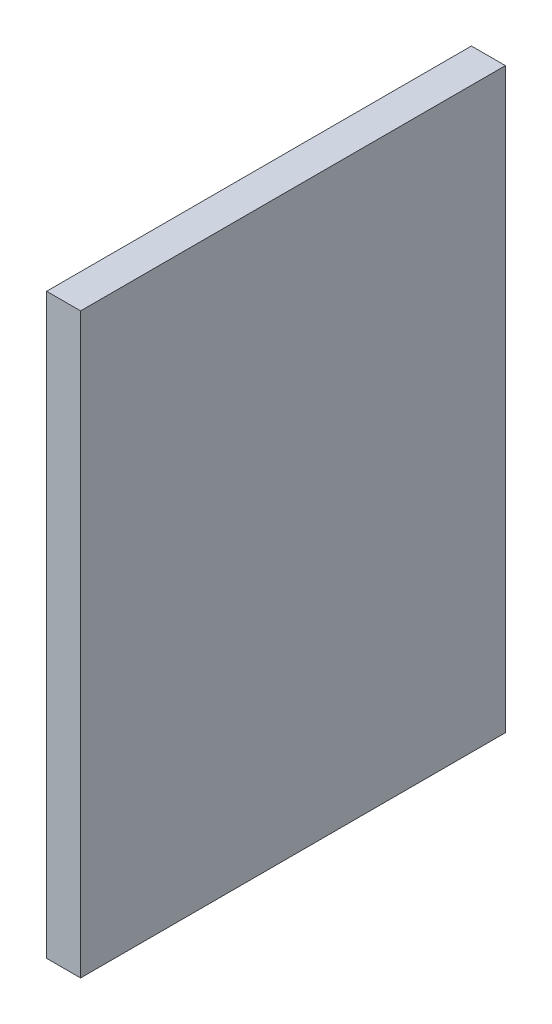
ISO-10303-21;
HEADER;
FILE_DESCRIPTION(('STEP AP214'),'2;1');
FILE_NAME('part.step','',(''),(''),'','','');
FILE_SCHEMA(('AUTOMOTIVE_DESIGN { 1 0 10303 214 1 1 1 1 }'));
ENDSEC;
DATA;
#1=APPLICATION_CONTEXT('core data for automotive mechanical design processes');
#2=APPLICATION_PROTOCOL_DEFINITION('international standard','automotive_design',2000,#1);
#3=PRODUCT_CONTEXT('',#1,'mechanical');
#4=PRODUCT('Part','Part','',(#3));
#5=PRODUCT_RELATED_PRODUCT_CATEGORY('part','',(#4));
#6=PRODUCT_DEFINITION_FORMATION('','',#4);
#7=PRODUCT_DEFINITION_CONTEXT('part definition',#1,'design');
#8=PRODUCT_DEFINITION('design','',#6,#7);
#9=PRODUCT_DEFINITION_SHAPE('','',#8);
#10=(LENGTH_UNIT() NAMED_UNIT(*) SI_UNIT(.MILLI.,.METRE.));
#11=(NAMED_UNIT(*) PLANE_ANGLE_UNIT() SI_UNIT($,.RADIAN.));
#12=(NAMED_UNIT(*) SI_UNIT($,.STERADIAN.) SOLID_ANGLE_UNIT());
#13=UNCERTAINTY_MEASURE_WITH_UNIT(LENGTH_MEASURE(1.E-05),#10,'distance_accuracy_value','');
#14=(GEOMETRIC_REPRESENTATION_CONTEXT(3) GLOBAL_UNCERTAINTY_ASSIGNED_CONTEXT((#13)) GLOBAL_UNIT_ASSIGNED_CONTEXT((#10,
#11,#12)) REPRESENTATION_CONTEXT('',''));
#15=CARTESIAN_POINT('',(0.,0.,0.));
#16=DIRECTION('',(0.,0.,1.));
#17=DIRECTION('',(1.,0.,0.));
#18=AXIS2_PLACEMENT_3D('',#15,#16,#17);
#19=CARTESIAN_POINT('',(113.,12.,37.));
#20=DIRECTION('',(1.,0.,0.));
#21=DIRECTION('',(0.,1.,0.));
#22=AXIS2_PLACEMENT_3D('',#19,#20,#21);
#23=PLANE('',#22);
#24=CARTESIAN_POINT('',(113.,12.,37.));
#25=DIRECTION('',(1.,0.,0.));
#26=DIRECTION('',(0.,1.,0.));
#27=AXIS2_PLACEMENT_3D('',#24,#25,#26);
#28=CIRCLE('',#27,1.5);
#29=CARTESIAN_POINT('',(113.,13.5,37.));
#30=VERTEX_POINT('',#29);
#31=EDGE_CURVE('E9',#30,#30,#28,.T.);
#32=ORIENTED_EDGE('',*,*,#31,.F.);
#33=EDGE_LOOP('',(#32));
#34=FACE_BOUND('',#33,.T.);
#35=ADVANCED_FACE('F15',(#34),#23,.F.);
#36=CARTESIAN_POINT('',(113.,30.5,37.));
#37=DIRECTION('',(1.,0.,0.));
#38=DIRECTION('',(0.,1.,0.));
#39=AXIS2_PLACEMENT_3D('',#36,#37,#38);
#40=PLANE('',#39);
#41=CARTESIAN_POINT('',(113.,30.5,37.));
#42=DIRECTION('',(1.,0.,0.));
#43=DIRECTION('',(0.,1.,0.));
#44=AXIS2_PLACEMENT_3D('',#41,#42,#43);
#45=CIRCLE('',#44,1.5);
#46=CARTESIAN_POINT('',(113.,32.,37.));
#47=VERTEX_POINT('',#46);
#48=EDGE_CURVE('E124',#47,#47,#45,.T.);
#49=ORIENTED_EDGE('',*,*,#48,.F.);
#50=EDGE_LOOP('',(#49));
#51=FACE_BOUND('',#50,.T.);
#52=ADVANCED_FACE('F195',(#51),#40,.F.);
#53=CARTESIAN_POINT('',(113.,49.,37.));
#54=DIRECTION('',(1.,0.,0.));
#55=DIRECTION('',(0.,1.,0.));
#56=AXIS2_PLACEMENT_3D('',#53,#54,#55);
#57=PLANE('',#56);
#58=CARTESIAN_POINT('',(113.,49.,37.));
#59=DIRECTION('',(1.,0.,0.));
#60=DIRECTION('',(0.,1.,0.));
#61=AXIS2_PLACEMENT_3D('',#58,#59,#60);
#62=CIRCLE('',#61,1.5);
#63=CARTESIAN_POINT('',(113.,50.5,37.));
#64=VERTEX_POINT('',#63);
#65=EDGE_CURVE('E137',#64,#64,#62,.T.);
#66=ORIENTED_EDGE('',*,*,#65,.F.);
#67=EDGE_LOOP('',(#66));
#68=FACE_BOUND('',#67,.T.);
#69=ADVANCED_FACE('F17',(#68),#57,.F.);
#70=CARTESIAN_POINT('',(115.,5.,1.5));
#71=DIRECTION('',(1.,0.,0.));
#72=DIRECTION('',(0.,1.,0.));
#73=AXIS2_PLACEMENT_3D('',#70,#71,#72);
#74=PLANE('',#73);
#75=DIRECTION('',(0.,0.,1.));
#76=VECTOR('',#75,1.);
#77=CARTESIAN_POINT('',(115.,5.,1.5));
#78=LINE('',#77,#76);
#79=CARTESIAN_POINT('',(115.,5.,1.5));
#80=VERTEX_POINT('',#79);
#81=CARTESIAN_POINT('',(115.,5.,39.));
#82=VERTEX_POINT('',#81);
#83=EDGE_CURVE('E105',#80,#82,#78,.T.);
#84=ORIENTED_EDGE('',*,*,#83,.F.);
#85=DIRECTION('',(0.,1.,0.));
#86=VECTOR('',#85,1.);
#87=CARTESIAN_POINT('',(115.,5.,1.5));
#88=LINE('',#87,#86);
#89=CARTESIAN_POINT('',(115.,56.,1.5));
#90=VERTEX_POINT('',#89);
#91=EDGE_CURVE('E100',#80,#90,#88,.T.);
#92=ORIENTED_EDGE('',*,*,#91,.T.);
#93=DIRECTION('',(0.,0.,1.));
#94=VECTOR('',#93,1.);
#95=CARTESIAN_POINT('',(115.,56.,1.5));
#96=LINE('',#95,#94);
#97=CARTESIAN_POINT('',(115.,56.,39.));
#98=VERTEX_POINT('',#97);
#99=EDGE_CURVE('E86',#90,#98,#96,.T.);
#100=ORIENTED_EDGE('',*,*,#99,.T.);
#101=DIRECTION('',(0.,1.,0.));
#102=VECTOR('',#101,1.);
#103=CARTESIAN_POINT('',(115.,5.,39.));
#104=LINE('',#103,#102);
#105=EDGE_CURVE('E120',#82,#98,#104,.T.);
#106=ORIENTED_EDGE('',*,*,#105,.F.);
#107=EDGE_LOOP('',(#84,#92,#100,#106));
#108=FACE_BOUND('',#107,.T.);
#109=ADVANCED_FACE('F103',(#108),#74,.T.);
#110=CARTESIAN_POINT('',(112.,12.,37.));
#111=DIRECTION('',(-1.,0.,0.));
#112=DIRECTION('',(0.,1.,0.));
#113=AXIS2_PLACEMENT_3D('',#110,#111,#112);
#114=CYLINDRICAL_SURFACE('',#113,1.5);
#115=DIRECTION('',(1.,0.,0.));
#116=VECTOR('',#115,1.);
#117=CARTESIAN_POINT('',(112.,13.5,37.));
#118=LINE('',#117,#116);
#119=CARTESIAN_POINT('',(112.,13.5,37.));
#120=VERTEX_POINT('',#119);
#121=EDGE_CURVE('E25',#120,#30,#118,.T.);
#122=ORIENTED_EDGE('',*,*,#121,.T.);
#123=ORIENTED_EDGE('',*,*,#31,.T.);
#124=ORIENTED_EDGE('',*,*,#121,.F.);
#125=CARTESIAN_POINT('',(112.,12.,37.));
#126=DIRECTION('',(1.,0.,0.));
#127=DIRECTION('',(0.,1.,0.));
#128=AXIS2_PLACEMENT_3D('',#125,#126,#127);
#129=CIRCLE('',#128,1.5);
#130=EDGE_CURVE('E158',#120,#120,#129,.T.);
#131=ORIENTED_EDGE('',*,*,#130,.F.);
#132=EDGE_LOOP('',(#122,#123,#124,#131));
#133=FACE_BOUND('',#132,.T.);
#134=ADVANCED_FACE('F180',(#133),#114,.F.);
#135=CARTESIAN_POINT('',(112.,30.5,37.));
#136=DIRECTION('',(-1.,0.,0.));
#137=DIRECTION('',(0.,1.,0.));
#138=AXIS2_PLACEMENT_3D('',#135,#136,#137);
#139=CYLINDRICAL_SURFACE('',#138,1.5);
#140=DIRECTION('',(1.,0.,0.));
#141=VECTOR('',#140,1.);
#142=CARTESIAN_POINT('',(112.,32.,37.));
#143=LINE('',#142,#141);
#144=CARTESIAN_POINT('',(112.,32.,37.));
#145=VERTEX_POINT('',#144);
#146=EDGE_CURVE('E139',#145,#47,#143,.T.);
#147=ORIENTED_EDGE('',*,*,#146,.T.);
#148=ORIENTED_EDGE('',*,*,#48,.T.);
#149=ORIENTED_EDGE('',*,*,#146,.F.);
#150=CARTESIAN_POINT('',(112.,30.5,37.));
#151=DIRECTION('',(1.,0.,0.));
#152=DIRECTION('',(0.,1.,0.));
#153=AXIS2_PLACEMENT_3D('',#150,#151,#152);
#154=CIRCLE('',#153,1.5);
#155=EDGE_CURVE('E172',#145,#145,#154,.T.);
#156=ORIENTED_EDGE('',*,*,#155,.F.);
#157=EDGE_LOOP('',(#147,#148,#149,#156));
#158=FACE_BOUND('',#157,.T.);
#159=ADVANCED_FACE('F182',(#158),#139,.F.);
#160=CARTESIAN_POINT('',(112.,49.,37.));
#161=DIRECTION('',(-1.,0.,0.));
#162=DIRECTION('',(0.,1.,0.));
#163=AXIS2_PLACEMENT_3D('',#160,#161,#162);
#164=CYLINDRICAL_SURFACE('',#163,1.5);
#165=DIRECTION('',(1.,0.,0.));
#166=VECTOR('',#165,1.);
#167=CARTESIAN_POINT('',(112.,50.5,37.));
#168=LINE('',#167,#166);
#169=CARTESIAN_POINT('',(112.,50.5,37.));
#170=VERTEX_POINT('',#169);
#171=EDGE_CURVE('E99',#170,#64,#168,.T.);
#172=ORIENTED_EDGE('',*,*,#171,.T.);
#173=ORIENTED_EDGE('',*,*,#65,.T.);
#174=ORIENTED_EDGE('',*,*,#171,.F.);
#175=CARTESIAN_POINT('',(112.,49.,37.));
#176=DIRECTION('',(1.,0.,0.));
#177=DIRECTION('',(0.,1.,0.));
#178=AXIS2_PLACEMENT_3D('',#175,#176,#177);
#179=CIRCLE('',#178,1.5);
#180=EDGE_CURVE('E167',#170,#170,#179,.T.);
#181=ORIENTED_EDGE('',*,*,#180,.F.);
#182=EDGE_LOOP('',(#172,#173,#174,#181));
#183=FACE_BOUND('',#182,.T.);
#184=ADVANCED_FACE('F189',(#183),#164,.F.);
#185=CARTESIAN_POINT('',(112.,56.,1.5));
#186=DIRECTION('',(0.,1.,0.));
#187=DIRECTION('',(1.,0.,0.));
#188=AXIS2_PLACEMENT_3D('',#185,#186,#187);
#189=PLANE('',#188);
#190=DIRECTION('',(1.,0.,0.));
#191=VECTOR('',#190,1.);
#192=CARTESIAN_POINT('',(112.,56.,1.5));
#193=LINE('',#192,#191);
#194=CARTESIAN_POINT('',(112.,56.,1.5));
#195=VERTEX_POINT('',#194);
#196=EDGE_CURVE('E94',#195,#90,#193,.T.);
#197=ORIENTED_EDGE('',*,*,#196,.F.);
#198=DIRECTION('',(0.,0.,1.));
#199=VECTOR('',#198,1.);
#200=CARTESIAN_POINT('',(112.,56.,1.5));
#201=LINE('',#200,#199);
#202=CARTESIAN_POINT('',(112.,56.,39.));
#203=VERTEX_POINT('',#202);
#204=EDGE_CURVE('E159',#195,#203,#201,.T.);
#205=ORIENTED_EDGE('',*,*,#204,.T.);
#206=DIRECTION('',(1.,0.,0.));
#207=VECTOR('',#206,1.);
#208=CARTESIAN_POINT('',(112.,56.,39.));
#209=LINE('',#208,#207);
#210=EDGE_CURVE('E96',#203,#98,#209,.T.);
#211=ORIENTED_EDGE('',*,*,#210,.T.);
#212=ORIENTED_EDGE('',*,*,#99,.F.);
#213=EDGE_LOOP('',(#197,#205,#211,#212));
#214=FACE_BOUND('',#213,.T.);
#215=ADVANCED_FACE('F91',(#214),#189,.T.);
#216=CARTESIAN_POINT('',(112.,5.,1.5));
#217=DIRECTION('',(0.,0.,1.));
#218=DIRECTION('',(1.,0.,0.));
#219=AXIS2_PLACEMENT_3D('',#216,#217,#218);
#220=PLANE('',#219);
#221=ORIENTED_EDGE('',*,*,#196,.T.);
#222=ORIENTED_EDGE('',*,*,#91,.F.);
#223=DIRECTION('',(1.,0.,0.));
#224=VECTOR('',#223,1.);
#225=CARTESIAN_POINT('',(112.,5.,1.5));
#226=LINE('',#225,#224);
#227=CARTESIAN_POINT('',(112.,5.,1.5));
#228=VERTEX_POINT('',#227);
#229=EDGE_CURVE('E129',#228,#80,#226,.T.);
#230=ORIENTED_EDGE('',*,*,#229,.F.);
#231=DIRECTION('',(0.,1.,0.));
#232=VECTOR('',#231,1.);
#233=CARTESIAN_POINT('',(112.,5.,1.5));
#234=LINE('',#233,#232);
#235=EDGE_CURVE('E112',#228,#195,#234,.T.);
#236=ORIENTED_EDGE('',*,*,#235,.T.);
#237=EDGE_LOOP('',(#221,#222,#230,#236));
#238=FACE_BOUND('',#237,.T.);
#239=ADVANCED_FACE('F110',(#238),#220,.F.);
#240=CARTESIAN_POINT('',(112.,5.,39.));
#241=DIRECTION('',(0.,0.,1.));
#242=DIRECTION('',(1.,0.,0.));
#243=AXIS2_PLACEMENT_3D('',#240,#241,#242);
#244=PLANE('',#243);
#245=DIRECTION('',(0.,1.,0.));
#246=VECTOR('',#245,1.);
#247=CARTESIAN_POINT('',(112.,5.,39.));
#248=LINE('',#247,#246);
#249=CARTESIAN_POINT('',(112.,5.,39.));
#250=VERTEX_POINT('',#249);
#251=EDGE_CURVE('E156',#250,#203,#248,.T.);
#252=ORIENTED_EDGE('',*,*,#251,.F.);
#253=DIRECTION('',(1.,0.,0.));
#254=VECTOR('',#253,1.);
#255=CARTESIAN_POINT('',(112.,5.,39.));
#256=LINE('',#255,#254);
#257=EDGE_CURVE('E126',#250,#82,#256,.T.);
#258=ORIENTED_EDGE('',*,*,#257,.T.);
#259=ORIENTED_EDGE('',*,*,#105,.T.);
#260=ORIENTED_EDGE('',*,*,#210,.F.);
#261=EDGE_LOOP('',(#252,#258,#259,#260));
#262=FACE_BOUND('',#261,.T.);
#263=ADVANCED_FACE('F205',(#262),#244,.T.);
#264=CARTESIAN_POINT('',(112.,5.,1.5));
#265=DIRECTION('',(0.,1.,0.));
#266=DIRECTION('',(1.,0.,0.));
#267=AXIS2_PLACEMENT_3D('',#264,#265,#266);
#268=PLANE('',#267);
#269=ORIENTED_EDGE('',*,*,#83,.T.);
#270=ORIENTED_EDGE('',*,*,#257,.F.);
#271=DIRECTION('',(0.,0.,1.));
#272=VECTOR('',#271,1.);
#273=CARTESIAN_POINT('',(112.,5.,1.5));
#274=LINE('',#273,#272);
#275=EDGE_CURVE('E164',#228,#250,#274,.T.);
#276=ORIENTED_EDGE('',*,*,#275,.F.);
#277=ORIENTED_EDGE('',*,*,#229,.T.);
#278=EDGE_LOOP('',(#269,#270,#276,#277));
#279=FACE_BOUND('',#278,.T.);
#280=ADVANCED_FACE('F203',(#279),#268,.F.);
#281=CARTESIAN_POINT('',(112.,5.,1.5));
#282=DIRECTION('',(1.,0.,0.));
#283=DIRECTION('',(0.,1.,0.));
#284=AXIS2_PLACEMENT_3D('',#281,#282,#283);
#285=PLANE('',#284);
#286=ORIENTED_EDGE('',*,*,#130,.T.);
#287=EDGE_LOOP('',(#286));
#288=FACE_BOUND('',#287,.T.);
#289=ORIENTED_EDGE('',*,*,#155,.T.);
#290=EDGE_LOOP('',(#289));
#291=FACE_BOUND('',#290,.T.);
#292=ORIENTED_EDGE('',*,*,#180,.T.);
#293=EDGE_LOOP('',(#292));
#294=FACE_BOUND('',#293,.T.);
#295=ORIENTED_EDGE('',*,*,#251,.T.);
#296=ORIENTED_EDGE('',*,*,#204,.F.);
#297=ORIENTED_EDGE('',*,*,#235,.F.);
#298=ORIENTED_EDGE('',*,*,#275,.T.);
#299=EDGE_LOOP('',(#295,#296,#297,#298));
#300=FACE_BOUND('',#299,.T.);
#301=ADVANCED_FACE('F178',(#288,#291,#294,#300),#285,.F.);
#302=CLOSED_SHELL('',(#35,#52,#69,#109,#134,#159,#184,#215,#239,#263,#280,#301));
#303=MANIFOLD_SOLID_BREP('B1',#302);
#304=ADVANCED_BREP_SHAPE_REPRESENTATION('',(#18,#303),#14);
#305=SHAPE_DEFINITION_REPRESENTATION(#9,#304);
ENDSEC;
END-ISO-10303-21;
